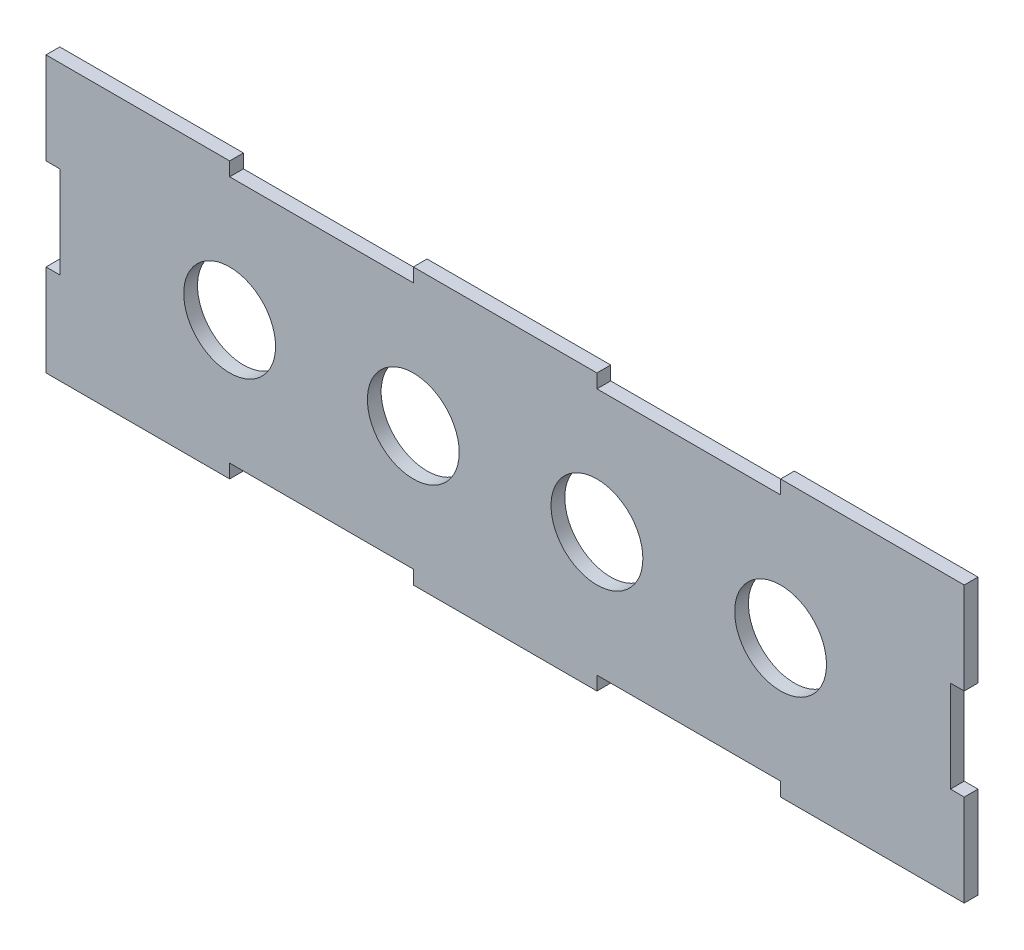
ISO-10303-21;
HEADER;
FILE_DESCRIPTION(('STEP AP214'),'2;1');
FILE_NAME('part.step','',(''),(''),'','','');
FILE_SCHEMA(('AUTOMOTIVE_DESIGN { 1 0 10303 214 1 1 1 1 }'));
ENDSEC;
DATA;
#1=APPLICATION_CONTEXT('core data for automotive mechanical design processes');
#2=APPLICATION_PROTOCOL_DEFINITION('international standard','automotive_design',2000,#1);
#3=PRODUCT_CONTEXT('',#1,'mechanical');
#4=PRODUCT('Part','Part','',(#3));
#5=PRODUCT_RELATED_PRODUCT_CATEGORY('part','',(#4));
#6=PRODUCT_DEFINITION_FORMATION('','',#4);
#7=PRODUCT_DEFINITION_CONTEXT('part definition',#1,'design');
#8=PRODUCT_DEFINITION('design','',#6,#7);
#9=PRODUCT_DEFINITION_SHAPE('','',#8);
#10=(LENGTH_UNIT() NAMED_UNIT(*) SI_UNIT(.MILLI.,.METRE.));
#11=(NAMED_UNIT(*) PLANE_ANGLE_UNIT() SI_UNIT($,.RADIAN.));
#12=(NAMED_UNIT(*) SI_UNIT($,.STERADIAN.) SOLID_ANGLE_UNIT());
#13=UNCERTAINTY_MEASURE_WITH_UNIT(LENGTH_MEASURE(1.E-05),#10,'distance_accuracy_value','');
#14=(GEOMETRIC_REPRESENTATION_CONTEXT(3) GLOBAL_UNCERTAINTY_ASSIGNED_CONTEXT((#13)) GLOBAL_UNIT_ASSIGNED_CONTEXT((#10,
#11,#12)) REPRESENTATION_CONTEXT('',''));
#15=CARTESIAN_POINT('',(0.,0.,0.));
#16=DIRECTION('',(0.,0.,1.));
#17=DIRECTION('',(1.,0.,0.));
#18=AXIS2_PLACEMENT_3D('',#15,#16,#17);
#19=CARTESIAN_POINT('',(-90.0000000000001,0.,3.));
#20=DIRECTION('',(1.,0.,0.));
#21=DIRECTION('',(0.,1.,0.));
#22=AXIS2_PLACEMENT_3D('',#19,#20,#21);
#23=PLANE('',#22);
#24=DIRECTION('',(0.,-1.,0.));
#25=VECTOR('',#24,1.);
#26=CARTESIAN_POINT('',(-90.0000000000001,0.,0.));
#27=LINE('',#26,#25);
#28=CARTESIAN_POINT('',(-90.0000000000001,30.,0.));
#29=VERTEX_POINT('',#28);
#30=CARTESIAN_POINT('',(-90.0000000000001,10.,0.));
#31=VERTEX_POINT('',#30);
#32=EDGE_CURVE('E255',#29,#31,#27,.T.);
#33=ORIENTED_EDGE('',*,*,#32,.T.);
#34=DIRECTION('',(0.,0.,-1.));
#35=VECTOR('',#34,1.);
#36=CARTESIAN_POINT('',(-90.0000000000001,10.,3.));
#37=LINE('',#36,#35);
#38=CARTESIAN_POINT('',(-90.0000000000001,10.,3.));
#39=VERTEX_POINT('',#38);
#40=EDGE_CURVE('E11',#39,#31,#37,.T.);
#41=ORIENTED_EDGE('',*,*,#40,.F.);
#42=DIRECTION('',(0.,-1.,0.));
#43=VECTOR('',#42,1.);
#44=CARTESIAN_POINT('',(-90.0000000000001,0.,3.));
#45=LINE('',#44,#43);
#46=CARTESIAN_POINT('',(-90.0000000000001,30.,3.));
#47=VERTEX_POINT('',#46);
#48=EDGE_CURVE('E324',#47,#39,#45,.T.);
#49=ORIENTED_EDGE('',*,*,#48,.F.);
#50=DIRECTION('',(0.,0.,-1.));
#51=VECTOR('',#50,1.);
#52=CARTESIAN_POINT('',(-90.0000000000001,30.,3.));
#53=LINE('',#52,#51);
#54=EDGE_CURVE('E54',#47,#29,#53,.T.);
#55=ORIENTED_EDGE('',*,*,#54,.T.);
#56=EDGE_LOOP('',(#33,#41,#49,#55));
#57=FACE_BOUND('',#56,.T.);
#58=ADVANCED_FACE('F38',(#57),#23,.F.);
#59=CARTESIAN_POINT('',(0.,10.,3.));
#60=DIRECTION('',(0.,1.,0.));
#61=DIRECTION('',(0.,0.,1.));
#62=AXIS2_PLACEMENT_3D('',#59,#60,#61);
#63=PLANE('',#62);
#64=DIRECTION('',(1.,0.,0.));
#65=VECTOR('',#64,1.);
#66=CARTESIAN_POINT('',(0.,10.,0.));
#67=LINE('',#66,#65);
#68=CARTESIAN_POINT('',(-87.0000000000001,10.,0.));
#69=VERTEX_POINT('',#68);
#70=EDGE_CURVE('E257',#31,#69,#67,.T.);
#71=ORIENTED_EDGE('',*,*,#70,.T.);
#72=DIRECTION('',(0.,0.,-1.));
#73=VECTOR('',#72,1.);
#74=CARTESIAN_POINT('',(-87.0000000000001,10.,3.));
#75=LINE('',#74,#73);
#76=CARTESIAN_POINT('',(-87.0000000000001,10.,3.));
#77=VERTEX_POINT('',#76);
#78=EDGE_CURVE('E46',#77,#69,#75,.T.);
#79=ORIENTED_EDGE('',*,*,#78,.F.);
#80=DIRECTION('',(1.,0.,0.));
#81=VECTOR('',#80,1.);
#82=CARTESIAN_POINT('',(0.,10.,3.));
#83=LINE('',#82,#81);
#84=EDGE_CURVE('E152',#39,#77,#83,.T.);
#85=ORIENTED_EDGE('',*,*,#84,.F.);
#86=ORIENTED_EDGE('',*,*,#40,.T.);
#87=EDGE_LOOP('',(#71,#79,#85,#86));
#88=FACE_BOUND('',#87,.T.);
#89=ADVANCED_FACE('F472',(#88),#63,.F.);
#90=CARTESIAN_POINT('',(-87.0000000000001,1.81105130891979E-13,3.));
#91=DIRECTION('',(1.,0.,0.));
#92=DIRECTION('',(0.,1.,0.));
#93=AXIS2_PLACEMENT_3D('',#90,#91,#92);
#94=PLANE('',#93);
#95=DIRECTION('',(0.,-1.,0.));
#96=VECTOR('',#95,1.);
#97=CARTESIAN_POINT('',(-87.0000000000001,1.81105130891979E-13,0.));
#98=LINE('',#97,#96);
#99=CARTESIAN_POINT('',(-87.0000000000001,-9.99999999999999,0.));
#100=VERTEX_POINT('',#99);
#101=EDGE_CURVE('E260',#69,#100,#98,.T.);
#102=ORIENTED_EDGE('',*,*,#101,.T.);
#103=DIRECTION('',(0.,0.,-1.));
#104=VECTOR('',#103,1.);
#105=CARTESIAN_POINT('',(-87.0000000000001,-9.99999999999999,3.));
#106=LINE('',#105,#104);
#107=CARTESIAN_POINT('',(-87.0000000000001,-9.99999999999999,3.));
#108=VERTEX_POINT('',#107);
#109=EDGE_CURVE('E380',#108,#100,#106,.T.);
#110=ORIENTED_EDGE('',*,*,#109,.F.);
#111=DIRECTION('',(0.,-1.,0.));
#112=VECTOR('',#111,1.);
#113=CARTESIAN_POINT('',(-87.0000000000001,1.81105130891979E-13,3.));
#114=LINE('',#113,#112);
#115=EDGE_CURVE('E388',#77,#108,#114,.T.);
#116=ORIENTED_EDGE('',*,*,#115,.F.);
#117=ORIENTED_EDGE('',*,*,#78,.T.);
#118=EDGE_LOOP('',(#102,#110,#116,#117));
#119=FACE_BOUND('',#118,.T.);
#120=ADVANCED_FACE('F386',(#119),#94,.F.);
#121=CARTESIAN_POINT('',(0.,-9.99999999999999,3.));
#122=DIRECTION('',(0.,-1.,0.));
#123=DIRECTION('',(0.,0.,-1.));
#124=AXIS2_PLACEMENT_3D('',#121,#122,#123);
#125=PLANE('',#124);
#126=DIRECTION('',(-1.,0.,0.));
#127=VECTOR('',#126,1.);
#128=CARTESIAN_POINT('',(0.,-9.99999999999999,0.));
#129=LINE('',#128,#127);
#130=CARTESIAN_POINT('',(-90.0000000000001,-9.99999999999999,0.));
#131=VERTEX_POINT('',#130);
#132=EDGE_CURVE('E262',#100,#131,#129,.T.);
#133=ORIENTED_EDGE('',*,*,#132,.T.);
#134=DIRECTION('',(0.,0.,-1.));
#135=VECTOR('',#134,1.);
#136=CARTESIAN_POINT('',(-90.0000000000001,-9.99999999999999,3.));
#137=LINE('',#136,#135);
#138=CARTESIAN_POINT('',(-90.0000000000001,-9.99999999999999,3.));
#139=VERTEX_POINT('',#138);
#140=EDGE_CURVE('E377',#139,#131,#137,.T.);
#141=ORIENTED_EDGE('',*,*,#140,.F.);
#142=DIRECTION('',(-1.,0.,0.));
#143=VECTOR('',#142,1.);
#144=CARTESIAN_POINT('',(0.,-9.99999999999999,3.));
#145=LINE('',#144,#143);
#146=EDGE_CURVE('E405',#108,#139,#145,.T.);
#147=ORIENTED_EDGE('',*,*,#146,.F.);
#148=ORIENTED_EDGE('',*,*,#109,.T.);
#149=EDGE_LOOP('',(#133,#141,#147,#148));
#150=FACE_BOUND('',#149,.T.);
#151=ADVANCED_FACE('F396',(#150),#125,.F.);
#152=CARTESIAN_POINT('',(-90.0000000000001,0.,3.));
#153=DIRECTION('',(1.,0.,0.));
#154=DIRECTION('',(0.,0.,-1.));
#155=AXIS2_PLACEMENT_3D('',#152,#153,#154);
#156=PLANE('',#155);
#157=DIRECTION('',(0.,-1.,0.));
#158=VECTOR('',#157,1.);
#159=CARTESIAN_POINT('',(-90.0000000000001,0.,0.));
#160=LINE('',#159,#158);
#161=CARTESIAN_POINT('',(-90.0000000000001,-30.,0.));
#162=VERTEX_POINT('',#161);
#163=EDGE_CURVE('E264',#131,#162,#160,.T.);
#164=ORIENTED_EDGE('',*,*,#163,.T.);
#165=DIRECTION('',(0.,0.,-1.));
#166=VECTOR('',#165,1.);
#167=CARTESIAN_POINT('',(-90.0000000000001,-30.,3.));
#168=LINE('',#167,#166);
#169=CARTESIAN_POINT('',(-90.0000000000001,-30.,3.));
#170=VERTEX_POINT('',#169);
#171=EDGE_CURVE('E374',#170,#162,#168,.T.);
#172=ORIENTED_EDGE('',*,*,#171,.F.);
#173=DIRECTION('',(0.,-1.,0.));
#174=VECTOR('',#173,1.);
#175=CARTESIAN_POINT('',(-90.0000000000001,0.,3.));
#176=LINE('',#175,#174);
#177=EDGE_CURVE('E402',#139,#170,#176,.T.);
#178=ORIENTED_EDGE('',*,*,#177,.F.);
#179=ORIENTED_EDGE('',*,*,#140,.T.);
#180=EDGE_LOOP('',(#164,#172,#178,#179));
#181=FACE_BOUND('',#180,.T.);
#182=ADVANCED_FACE('F400',(#181),#156,.F.);
#183=CARTESIAN_POINT('',(0.,-30.,3.));
#184=DIRECTION('',(0.,1.,0.));
#185=DIRECTION('',(0.,0.,1.));
#186=AXIS2_PLACEMENT_3D('',#183,#184,#185);
#187=PLANE('',#186);
#188=DIRECTION('',(1.,0.,0.));
#189=VECTOR('',#188,1.);
#190=CARTESIAN_POINT('',(0.,-30.,0.));
#191=LINE('',#190,#189);
#192=CARTESIAN_POINT('',(-50.0000000000001,-30.,0.));
#193=VERTEX_POINT('',#192);
#194=EDGE_CURVE('E266',#162,#193,#191,.T.);
#195=ORIENTED_EDGE('',*,*,#194,.T.);
#196=DIRECTION('',(0.,0.,-1.));
#197=VECTOR('',#196,1.);
#198=CARTESIAN_POINT('',(-50.0000000000001,-30.,3.));
#199=LINE('',#198,#197);
#200=CARTESIAN_POINT('',(-50.0000000000001,-30.,3.));
#201=VERTEX_POINT('',#200);
#202=EDGE_CURVE('E371',#201,#193,#199,.T.);
#203=ORIENTED_EDGE('',*,*,#202,.F.);
#204=DIRECTION('',(1.,0.,0.));
#205=VECTOR('',#204,1.);
#206=CARTESIAN_POINT('',(0.,-30.,3.));
#207=LINE('',#206,#205);
#208=EDGE_CURVE('E404',#170,#201,#207,.T.);
#209=ORIENTED_EDGE('',*,*,#208,.F.);
#210=ORIENTED_EDGE('',*,*,#171,.T.);
#211=EDGE_LOOP('',(#195,#203,#209,#210));
#212=FACE_BOUND('',#211,.T.);
#213=ADVANCED_FACE('F780',(#212),#187,.F.);
#214=CARTESIAN_POINT('',(-50.0000000000001,0.,3.));
#215=DIRECTION('',(-1.,0.,0.));
#216=DIRECTION('',(0.,0.,1.));
#217=AXIS2_PLACEMENT_3D('',#214,#215,#216);
#218=PLANE('',#217);
#219=DIRECTION('',(0.,1.,0.));
#220=VECTOR('',#219,1.);
#221=CARTESIAN_POINT('',(-50.0000000000001,0.,0.));
#222=LINE('',#221,#220);
#223=CARTESIAN_POINT('',(-50.0000000000001,-27.,0.));
#224=VERTEX_POINT('',#223);
#225=EDGE_CURVE('E268',#193,#224,#222,.T.);
#226=ORIENTED_EDGE('',*,*,#225,.T.);
#227=DIRECTION('',(0.,0.,-1.));
#228=VECTOR('',#227,1.);
#229=CARTESIAN_POINT('',(-50.0000000000001,-27.,3.));
#230=LINE('',#229,#228);
#231=CARTESIAN_POINT('',(-50.0000000000001,-27.,3.));
#232=VERTEX_POINT('',#231);
#233=EDGE_CURVE('E368',#232,#224,#230,.T.);
#234=ORIENTED_EDGE('',*,*,#233,.F.);
#235=DIRECTION('',(0.,1.,0.));
#236=VECTOR('',#235,1.);
#237=CARTESIAN_POINT('',(-50.0000000000001,0.,3.));
#238=LINE('',#237,#236);
#239=EDGE_CURVE('E407',#201,#232,#238,.T.);
#240=ORIENTED_EDGE('',*,*,#239,.F.);
#241=ORIENTED_EDGE('',*,*,#202,.T.);
#242=EDGE_LOOP('',(#226,#234,#240,#241));
#243=FACE_BOUND('',#242,.T.);
#244=ADVANCED_FACE('F770',(#243),#218,.F.);
#245=CARTESIAN_POINT('',(0.,-27.,3.));
#246=DIRECTION('',(0.,1.,0.));
#247=DIRECTION('',(0.,0.,1.));
#248=AXIS2_PLACEMENT_3D('',#245,#246,#247);
#249=PLANE('',#248);
#250=DIRECTION('',(1.,0.,0.));
#251=VECTOR('',#250,1.);
#252=CARTESIAN_POINT('',(0.,-27.,0.));
#253=LINE('',#252,#251);
#254=CARTESIAN_POINT('',(-10.0000000000001,-27.,0.));
#255=VERTEX_POINT('',#254);
#256=EDGE_CURVE('E270',#224,#255,#253,.T.);
#257=ORIENTED_EDGE('',*,*,#256,.T.);
#258=DIRECTION('',(0.,0.,-1.));
#259=VECTOR('',#258,1.);
#260=CARTESIAN_POINT('',(-10.0000000000001,-27.,3.));
#261=LINE('',#260,#259);
#262=CARTESIAN_POINT('',(-10.0000000000001,-27.,3.));
#263=VERTEX_POINT('',#262);
#264=EDGE_CURVE('E365',#263,#255,#261,.T.);
#265=ORIENTED_EDGE('',*,*,#264,.F.);
#266=DIRECTION('',(1.,0.,0.));
#267=VECTOR('',#266,1.);
#268=CARTESIAN_POINT('',(0.,-27.,3.));
#269=LINE('',#268,#267);
#270=EDGE_CURVE('E413',#232,#263,#269,.T.);
#271=ORIENTED_EDGE('',*,*,#270,.F.);
#272=ORIENTED_EDGE('',*,*,#233,.T.);
#273=EDGE_LOOP('',(#257,#265,#271,#272));
#274=FACE_BOUND('',#273,.T.);
#275=ADVANCED_FACE('F759',(#274),#249,.F.);
#276=CARTESIAN_POINT('',(-10.0000000000001,0.,3.));
#277=DIRECTION('',(1.,0.,0.));
#278=DIRECTION('',(0.,0.,-1.));
#279=AXIS2_PLACEMENT_3D('',#276,#277,#278);
#280=PLANE('',#279);
#281=DIRECTION('',(0.,-1.,0.));
#282=VECTOR('',#281,1.);
#283=CARTESIAN_POINT('',(-10.0000000000001,0.,0.));
#284=LINE('',#283,#282);
#285=CARTESIAN_POINT('',(-10.0000000000001,-30.,0.));
#286=VERTEX_POINT('',#285);
#287=EDGE_CURVE('E272',#255,#286,#284,.T.);
#288=ORIENTED_EDGE('',*,*,#287,.T.);
#289=DIRECTION('',(0.,0.,-1.));
#290=VECTOR('',#289,1.);
#291=CARTESIAN_POINT('',(-10.0000000000001,-30.,3.));
#292=LINE('',#291,#290);
#293=CARTESIAN_POINT('',(-10.0000000000001,-30.,3.));
#294=VERTEX_POINT('',#293);
#295=EDGE_CURVE('E362',#294,#286,#292,.T.);
#296=ORIENTED_EDGE('',*,*,#295,.F.);
#297=DIRECTION('',(0.,-1.,0.));
#298=VECTOR('',#297,1.);
#299=CARTESIAN_POINT('',(-10.0000000000001,0.,3.));
#300=LINE('',#299,#298);
#301=EDGE_CURVE('E415',#263,#294,#300,.T.);
#302=ORIENTED_EDGE('',*,*,#301,.F.);
#303=ORIENTED_EDGE('',*,*,#264,.T.);
#304=EDGE_LOOP('',(#288,#296,#302,#303));
#305=FACE_BOUND('',#304,.T.);
#306=ADVANCED_FACE('F748',(#305),#280,.F.);
#307=CARTESIAN_POINT('',(0.,-30.,3.));
#308=DIRECTION('',(0.,1.,0.));
#309=DIRECTION('',(0.,0.,1.));
#310=AXIS2_PLACEMENT_3D('',#307,#308,#309);
#311=PLANE('',#310);
#312=DIRECTION('',(1.,0.,0.));
#313=VECTOR('',#312,1.);
#314=CARTESIAN_POINT('',(0.,-30.,0.));
#315=LINE('',#314,#313);
#316=CARTESIAN_POINT('',(29.9999999999999,-30.,0.));
#317=VERTEX_POINT('',#316);
#318=EDGE_CURVE('E274',#286,#317,#315,.T.);
#319=ORIENTED_EDGE('',*,*,#318,.T.);
#320=DIRECTION('',(0.,0.,-1.));
#321=VECTOR('',#320,1.);
#322=CARTESIAN_POINT('',(29.9999999999999,-30.,3.));
#323=LINE('',#322,#321);
#324=CARTESIAN_POINT('',(29.9999999999999,-30.,3.));
#325=VERTEX_POINT('',#324);
#326=EDGE_CURVE('E359',#325,#317,#323,.T.);
#327=ORIENTED_EDGE('',*,*,#326,.F.);
#328=DIRECTION('',(1.,0.,0.));
#329=VECTOR('',#328,1.);
#330=CARTESIAN_POINT('',(0.,-30.,3.));
#331=LINE('',#330,#329);
#332=EDGE_CURVE('E417',#294,#325,#331,.T.);
#333=ORIENTED_EDGE('',*,*,#332,.F.);
#334=ORIENTED_EDGE('',*,*,#295,.T.);
#335=EDGE_LOOP('',(#319,#327,#333,#334));
#336=FACE_BOUND('',#335,.T.);
#337=ADVANCED_FACE('F738',(#336),#311,.F.);
#338=CARTESIAN_POINT('',(29.9999999999999,0.,3.));
#339=DIRECTION('',(-1.,0.,0.));
#340=DIRECTION('',(0.,0.,1.));
#341=AXIS2_PLACEMENT_3D('',#338,#339,#340);
#342=PLANE('',#341);
#343=DIRECTION('',(0.,1.,0.));
#344=VECTOR('',#343,1.);
#345=CARTESIAN_POINT('',(29.9999999999999,0.,0.));
#346=LINE('',#345,#344);
#347=CARTESIAN_POINT('',(29.9999999999999,-27.,0.));
#348=VERTEX_POINT('',#347);
#349=EDGE_CURVE('E276',#317,#348,#346,.T.);
#350=ORIENTED_EDGE('',*,*,#349,.T.);
#351=DIRECTION('',(0.,0.,-1.));
#352=VECTOR('',#351,1.);
#353=CARTESIAN_POINT('',(29.9999999999999,-27.,3.));
#354=LINE('',#353,#352);
#355=CARTESIAN_POINT('',(29.9999999999999,-27.,3.));
#356=VERTEX_POINT('',#355);
#357=EDGE_CURVE('E356',#356,#348,#354,.T.);
#358=ORIENTED_EDGE('',*,*,#357,.F.);
#359=DIRECTION('',(0.,1.,0.));
#360=VECTOR('',#359,1.);
#361=CARTESIAN_POINT('',(29.9999999999999,0.,3.));
#362=LINE('',#361,#360);
#363=EDGE_CURVE('E419',#325,#356,#362,.T.);
#364=ORIENTED_EDGE('',*,*,#363,.F.);
#365=ORIENTED_EDGE('',*,*,#326,.T.);
#366=EDGE_LOOP('',(#350,#358,#364,#365));
#367=FACE_BOUND('',#366,.T.);
#368=ADVANCED_FACE('F728',(#367),#342,.F.);
#369=CARTESIAN_POINT('',(0.,-27.,3.));
#370=DIRECTION('',(0.,1.,0.));
#371=DIRECTION('',(-1.,0.,0.));
#372=AXIS2_PLACEMENT_3D('',#369,#370,#371);
#373=PLANE('',#372);
#374=DIRECTION('',(1.,0.,0.));
#375=VECTOR('',#374,1.);
#376=CARTESIAN_POINT('',(0.,-27.,0.));
#377=LINE('',#376,#375);
#378=CARTESIAN_POINT('',(69.9999999999999,-27.,0.));
#379=VERTEX_POINT('',#378);
#380=EDGE_CURVE('E278',#348,#379,#377,.T.);
#381=ORIENTED_EDGE('',*,*,#380,.T.);
#382=DIRECTION('',(0.,0.,-1.));
#383=VECTOR('',#382,1.);
#384=CARTESIAN_POINT('',(69.9999999999999,-27.,3.));
#385=LINE('',#384,#383);
#386=CARTESIAN_POINT('',(69.9999999999999,-27.,3.));
#387=VERTEX_POINT('',#386);
#388=EDGE_CURVE('E353',#387,#379,#385,.T.);
#389=ORIENTED_EDGE('',*,*,#388,.F.);
#390=DIRECTION('',(1.,0.,0.));
#391=VECTOR('',#390,1.);
#392=CARTESIAN_POINT('',(0.,-27.,3.));
#393=LINE('',#392,#391);
#394=EDGE_CURVE('E421',#356,#387,#393,.T.);
#395=ORIENTED_EDGE('',*,*,#394,.F.);
#396=ORIENTED_EDGE('',*,*,#357,.T.);
#397=EDGE_LOOP('',(#381,#389,#395,#396));
#398=FACE_BOUND('',#397,.T.);
#399=ADVANCED_FACE('F717',(#398),#373,.F.);
#400=CARTESIAN_POINT('',(69.9999999999999,0.,3.));
#401=DIRECTION('',(1.,0.,0.));
#402=DIRECTION('',(0.,0.,-1.));
#403=AXIS2_PLACEMENT_3D('',#400,#401,#402);
#404=PLANE('',#403);
#405=DIRECTION('',(0.,-1.,0.));
#406=VECTOR('',#405,1.);
#407=CARTESIAN_POINT('',(69.9999999999999,0.,0.));
#408=LINE('',#407,#406);
#409=CARTESIAN_POINT('',(69.9999999999999,-30.,0.));
#410=VERTEX_POINT('',#409);
#411=EDGE_CURVE('E280',#379,#410,#408,.T.);
#412=ORIENTED_EDGE('',*,*,#411,.T.);
#413=DIRECTION('',(0.,0.,-1.));
#414=VECTOR('',#413,1.);
#415=CARTESIAN_POINT('',(69.9999999999999,-30.,3.));
#416=LINE('',#415,#414);
#417=CARTESIAN_POINT('',(69.9999999999999,-30.,3.));
#418=VERTEX_POINT('',#417);
#419=EDGE_CURVE('E350',#418,#410,#416,.T.);
#420=ORIENTED_EDGE('',*,*,#419,.F.);
#421=DIRECTION('',(0.,-1.,0.));
#422=VECTOR('',#421,1.);
#423=CARTESIAN_POINT('',(69.9999999999999,0.,3.));
#424=LINE('',#423,#422);
#425=EDGE_CURVE('E423',#387,#418,#424,.T.);
#426=ORIENTED_EDGE('',*,*,#425,.F.);
#427=ORIENTED_EDGE('',*,*,#388,.T.);
#428=EDGE_LOOP('',(#412,#420,#426,#427));
#429=FACE_BOUND('',#428,.T.);
#430=ADVANCED_FACE('F706',(#429),#404,.F.);
#431=CARTESIAN_POINT('',(0.,-30.,3.));
#432=DIRECTION('',(0.,1.,0.));
#433=DIRECTION('',(0.,0.,1.));
#434=AXIS2_PLACEMENT_3D('',#431,#432,#433);
#435=PLANE('',#434);
#436=DIRECTION('',(1.,0.,0.));
#437=VECTOR('',#436,1.);
#438=CARTESIAN_POINT('',(0.,-30.,0.));
#439=LINE('',#438,#437);
#440=CARTESIAN_POINT('',(110.,-30.,0.));
#441=VERTEX_POINT('',#440);
#442=EDGE_CURVE('E282',#410,#441,#439,.T.);
#443=ORIENTED_EDGE('',*,*,#442,.T.);
#444=DIRECTION('',(0.,0.,-1.));
#445=VECTOR('',#444,1.);
#446=CARTESIAN_POINT('',(110.,-30.,3.));
#447=LINE('',#446,#445);
#448=CARTESIAN_POINT('',(110.,-30.,3.));
#449=VERTEX_POINT('',#448);
#450=EDGE_CURVE('E348',#449,#441,#447,.T.);
#451=ORIENTED_EDGE('',*,*,#450,.F.);
#452=DIRECTION('',(1.,0.,0.));
#453=VECTOR('',#452,1.);
#454=CARTESIAN_POINT('',(0.,-30.,3.));
#455=LINE('',#454,#453);
#456=EDGE_CURVE('E425',#418,#449,#455,.T.);
#457=ORIENTED_EDGE('',*,*,#456,.F.);
#458=ORIENTED_EDGE('',*,*,#419,.T.);
#459=EDGE_LOOP('',(#443,#451,#457,#458));
#460=FACE_BOUND('',#459,.T.);
#461=ADVANCED_FACE('F696',(#460),#435,.F.);
#462=CARTESIAN_POINT('',(110.,0.,3.));
#463=DIRECTION('',(1.,0.,0.));
#464=DIRECTION('',(0.,1.,0.));
#465=AXIS2_PLACEMENT_3D('',#462,#463,#464);
#466=PLANE('',#465);
#467=DIRECTION('',(0.,-1.,0.));
#468=VECTOR('',#467,1.);
#469=CARTESIAN_POINT('',(110.,0.,0.));
#470=LINE('',#469,#468);
#471=CARTESIAN_POINT('',(110.,-9.99999999999999,0.));
#472=VERTEX_POINT('',#471);
#473=EDGE_CURVE('E285',#472,#441,#470,.T.);
#474=ORIENTED_EDGE('',*,*,#473,.F.);
#475=DIRECTION('',(0.,0.,-1.));
#476=VECTOR('',#475,1.);
#477=CARTESIAN_POINT('',(110.,-9.99999999999999,3.));
#478=LINE('',#477,#476);
#479=CARTESIAN_POINT('',(110.,-9.99999999999999,3.));
#480=VERTEX_POINT('',#479);
#481=EDGE_CURVE('E346',#480,#472,#478,.T.);
#482=ORIENTED_EDGE('',*,*,#481,.F.);
#483=DIRECTION('',(0.,-1.,0.));
#484=VECTOR('',#483,1.);
#485=CARTESIAN_POINT('',(110.,0.,3.));
#486=LINE('',#485,#484);
#487=EDGE_CURVE('E427',#480,#449,#486,.T.);
#488=ORIENTED_EDGE('',*,*,#487,.T.);
#489=ORIENTED_EDGE('',*,*,#450,.T.);
#490=EDGE_LOOP('',(#474,#482,#488,#489));
#491=FACE_BOUND('',#490,.T.);
#492=ADVANCED_FACE('F686',(#491),#466,.T.);
#493=CARTESIAN_POINT('',(0.,-9.99999999999999,3.));
#494=DIRECTION('',(0.,1.,0.));
#495=DIRECTION('',(0.,0.,1.));
#496=AXIS2_PLACEMENT_3D('',#493,#494,#495);
#497=PLANE('',#496);
#498=DIRECTION('',(1.,0.,0.));
#499=VECTOR('',#498,1.);
#500=CARTESIAN_POINT('',(0.,-9.99999999999999,0.));
#501=LINE('',#500,#499);
#502=CARTESIAN_POINT('',(107.,-9.99999999999999,0.));
#503=VERTEX_POINT('',#502);
#504=EDGE_CURVE('E288',#503,#472,#501,.T.);
#505=ORIENTED_EDGE('',*,*,#504,.F.);
#506=DIRECTION('',(0.,0.,-1.));
#507=VECTOR('',#506,1.);
#508=CARTESIAN_POINT('',(107.,-9.99999999999999,3.));
#509=LINE('',#508,#507);
#510=CARTESIAN_POINT('',(107.,-9.99999999999999,3.));
#511=VERTEX_POINT('',#510);
#512=EDGE_CURVE('E344',#511,#503,#509,.T.);
#513=ORIENTED_EDGE('',*,*,#512,.F.);
#514=DIRECTION('',(1.,0.,0.));
#515=VECTOR('',#514,1.);
#516=CARTESIAN_POINT('',(0.,-9.99999999999999,3.));
#517=LINE('',#516,#515);
#518=EDGE_CURVE('E430',#511,#480,#517,.T.);
#519=ORIENTED_EDGE('',*,*,#518,.T.);
#520=ORIENTED_EDGE('',*,*,#481,.T.);
#521=EDGE_LOOP('',(#505,#513,#519,#520));
#522=FACE_BOUND('',#521,.T.);
#523=ADVANCED_FACE('F676',(#522),#497,.T.);
#524=CARTESIAN_POINT('',(107.,0.,3.));
#525=DIRECTION('',(1.,0.,0.));
#526=DIRECTION('',(0.,1.,0.));
#527=AXIS2_PLACEMENT_3D('',#524,#525,#526);
#528=PLANE('',#527);
#529=DIRECTION('',(0.,-1.,0.));
#530=VECTOR('',#529,1.);
#531=CARTESIAN_POINT('',(107.,0.,0.));
#532=LINE('',#531,#530);
#533=CARTESIAN_POINT('',(107.,10.,0.));
#534=VERTEX_POINT('',#533);
#535=EDGE_CURVE('E291',#534,#503,#532,.T.);
#536=ORIENTED_EDGE('',*,*,#535,.F.);
#537=DIRECTION('',(0.,0.,-1.));
#538=VECTOR('',#537,1.);
#539=CARTESIAN_POINT('',(107.,10.,3.));
#540=LINE('',#539,#538);
#541=CARTESIAN_POINT('',(107.,10.,3.));
#542=VERTEX_POINT('',#541);
#543=EDGE_CURVE('E342',#542,#534,#540,.T.);
#544=ORIENTED_EDGE('',*,*,#543,.F.);
#545=DIRECTION('',(0.,-1.,0.));
#546=VECTOR('',#545,1.);
#547=CARTESIAN_POINT('',(107.,0.,3.));
#548=LINE('',#547,#546);
#549=EDGE_CURVE('E433',#542,#511,#548,.T.);
#550=ORIENTED_EDGE('',*,*,#549,.T.);
#551=ORIENTED_EDGE('',*,*,#512,.T.);
#552=EDGE_LOOP('',(#536,#544,#550,#551));
#553=FACE_BOUND('',#552,.T.);
#554=ADVANCED_FACE('F666',(#553),#528,.T.);
#555=CARTESIAN_POINT('',(0.,10.,3.));
#556=DIRECTION('',(0.,-1.,0.));
#557=DIRECTION('',(0.,0.,-1.));
#558=AXIS2_PLACEMENT_3D('',#555,#556,#557);
#559=PLANE('',#558);
#560=DIRECTION('',(-1.,0.,0.));
#561=VECTOR('',#560,1.);
#562=CARTESIAN_POINT('',(0.,10.,0.));
#563=LINE('',#562,#561);
#564=CARTESIAN_POINT('',(110.,10.,0.));
#565=VERTEX_POINT('',#564);
#566=EDGE_CURVE('E294',#565,#534,#563,.T.);
#567=ORIENTED_EDGE('',*,*,#566,.F.);
#568=DIRECTION('',(0.,0.,-1.));
#569=VECTOR('',#568,1.);
#570=CARTESIAN_POINT('',(110.,10.,3.));
#571=LINE('',#570,#569);
#572=CARTESIAN_POINT('',(110.,10.,3.));
#573=VERTEX_POINT('',#572);
#574=EDGE_CURVE('E340',#573,#565,#571,.T.);
#575=ORIENTED_EDGE('',*,*,#574,.F.);
#576=DIRECTION('',(-1.,0.,0.));
#577=VECTOR('',#576,1.);
#578=CARTESIAN_POINT('',(0.,10.,3.));
#579=LINE('',#578,#577);
#580=EDGE_CURVE('E436',#573,#542,#579,.T.);
#581=ORIENTED_EDGE('',*,*,#580,.T.);
#582=ORIENTED_EDGE('',*,*,#543,.T.);
#583=EDGE_LOOP('',(#567,#575,#581,#582));
#584=FACE_BOUND('',#583,.T.);
#585=ADVANCED_FACE('F655',(#584),#559,.T.);
#586=CARTESIAN_POINT('',(110.,0.,3.));
#587=DIRECTION('',(1.,0.,0.));
#588=DIRECTION('',(0.,1.,0.));
#589=AXIS2_PLACEMENT_3D('',#586,#587,#588);
#590=PLANE('',#589);
#591=DIRECTION('',(0.,-1.,0.));
#592=VECTOR('',#591,1.);
#593=CARTESIAN_POINT('',(110.,0.,0.));
#594=LINE('',#593,#592);
#595=CARTESIAN_POINT('',(110.,30.,0.));
#596=VERTEX_POINT('',#595);
#597=EDGE_CURVE('E297',#596,#565,#594,.T.);
#598=ORIENTED_EDGE('',*,*,#597,.F.);
#599=DIRECTION('',(0.,0.,-1.));
#600=VECTOR('',#599,1.);
#601=CARTESIAN_POINT('',(110.,30.,3.));
#602=LINE('',#601,#600);
#603=CARTESIAN_POINT('',(110.,30.,3.));
#604=VERTEX_POINT('',#603);
#605=EDGE_CURVE('E338',#604,#596,#602,.T.);
#606=ORIENTED_EDGE('',*,*,#605,.F.);
#607=DIRECTION('',(0.,-1.,0.));
#608=VECTOR('',#607,1.);
#609=CARTESIAN_POINT('',(110.,0.,3.));
#610=LINE('',#609,#608);
#611=EDGE_CURVE('E439',#604,#573,#610,.T.);
#612=ORIENTED_EDGE('',*,*,#611,.T.);
#613=ORIENTED_EDGE('',*,*,#574,.T.);
#614=EDGE_LOOP('',(#598,#606,#612,#613));
#615=FACE_BOUND('',#614,.T.);
#616=ADVANCED_FACE('F644',(#615),#590,.T.);
#617=CARTESIAN_POINT('',(0.,30.,3.));
#618=DIRECTION('',(0.,1.,0.));
#619=DIRECTION('',(0.,0.,1.));
#620=AXIS2_PLACEMENT_3D('',#617,#618,#619);
#621=PLANE('',#620);
#622=DIRECTION('',(1.,0.,0.));
#623=VECTOR('',#622,1.);
#624=CARTESIAN_POINT('',(0.,30.,0.));
#625=LINE('',#624,#623);
#626=CARTESIAN_POINT('',(69.9999999999999,30.,0.));
#627=VERTEX_POINT('',#626);
#628=EDGE_CURVE('E300',#627,#596,#625,.T.);
#629=ORIENTED_EDGE('',*,*,#628,.F.);
#630=DIRECTION('',(0.,0.,-1.));
#631=VECTOR('',#630,1.);
#632=CARTESIAN_POINT('',(69.9999999999999,30.,3.));
#633=LINE('',#632,#631);
#634=CARTESIAN_POINT('',(69.9999999999999,30.,3.));
#635=VERTEX_POINT('',#634);
#636=EDGE_CURVE('E336',#635,#627,#633,.T.);
#637=ORIENTED_EDGE('',*,*,#636,.F.);
#638=DIRECTION('',(1.,0.,0.));
#639=VECTOR('',#638,1.);
#640=CARTESIAN_POINT('',(0.,30.,3.));
#641=LINE('',#640,#639);
#642=EDGE_CURVE('E442',#635,#604,#641,.T.);
#643=ORIENTED_EDGE('',*,*,#642,.T.);
#644=ORIENTED_EDGE('',*,*,#605,.T.);
#645=EDGE_LOOP('',(#629,#637,#643,#644));
#646=FACE_BOUND('',#645,.T.);
#647=ADVANCED_FACE('F634',(#646),#621,.T.);
#648=CARTESIAN_POINT('',(69.9999999999999,0.,3.));
#649=DIRECTION('',(-1.,0.,0.));
#650=DIRECTION('',(0.,0.,1.));
#651=AXIS2_PLACEMENT_3D('',#648,#649,#650);
#652=PLANE('',#651);
#653=DIRECTION('',(0.,1.,0.));
#654=VECTOR('',#653,1.);
#655=CARTESIAN_POINT('',(69.9999999999999,0.,0.));
#656=LINE('',#655,#654);
#657=CARTESIAN_POINT('',(69.9999999999999,27.,0.));
#658=VERTEX_POINT('',#657);
#659=EDGE_CURVE('E303',#658,#627,#656,.T.);
#660=ORIENTED_EDGE('',*,*,#659,.F.);
#661=DIRECTION('',(0.,0.,-1.));
#662=VECTOR('',#661,1.);
#663=CARTESIAN_POINT('',(69.9999999999999,27.,3.));
#664=LINE('',#663,#662);
#665=CARTESIAN_POINT('',(69.9999999999999,27.,3.));
#666=VERTEX_POINT('',#665);
#667=EDGE_CURVE('E334',#666,#658,#664,.T.);
#668=ORIENTED_EDGE('',*,*,#667,.F.);
#669=DIRECTION('',(0.,1.,0.));
#670=VECTOR('',#669,1.);
#671=CARTESIAN_POINT('',(69.9999999999999,0.,3.));
#672=LINE('',#671,#670);
#673=EDGE_CURVE('E445',#666,#635,#672,.T.);
#674=ORIENTED_EDGE('',*,*,#673,.T.);
#675=ORIENTED_EDGE('',*,*,#636,.T.);
#676=EDGE_LOOP('',(#660,#668,#674,#675));
#677=FACE_BOUND('',#676,.T.);
#678=ADVANCED_FACE('F624',(#677),#652,.T.);
#679=CARTESIAN_POINT('',(0.,27.,3.));
#680=DIRECTION('',(0.,1.,0.));
#681=DIRECTION('',(-1.,0.,0.));
#682=AXIS2_PLACEMENT_3D('',#679,#680,#681);
#683=PLANE('',#682);
#684=DIRECTION('',(1.,0.,0.));
#685=VECTOR('',#684,1.);
#686=CARTESIAN_POINT('',(0.,27.,0.));
#687=LINE('',#686,#685);
#688=CARTESIAN_POINT('',(29.9999999999999,27.,0.));
#689=VERTEX_POINT('',#688);
#690=EDGE_CURVE('E306',#689,#658,#687,.T.);
#691=ORIENTED_EDGE('',*,*,#690,.F.);
#692=DIRECTION('',(0.,0.,-1.));
#693=VECTOR('',#692,1.);
#694=CARTESIAN_POINT('',(29.9999999999999,27.,3.));
#695=LINE('',#694,#693);
#696=CARTESIAN_POINT('',(29.9999999999999,27.,3.));
#697=VERTEX_POINT('',#696);
#698=EDGE_CURVE('E332',#697,#689,#695,.T.);
#699=ORIENTED_EDGE('',*,*,#698,.F.);
#700=DIRECTION('',(1.,0.,0.));
#701=VECTOR('',#700,1.);
#702=CARTESIAN_POINT('',(0.,27.,3.));
#703=LINE('',#702,#701);
#704=EDGE_CURVE('E448',#697,#666,#703,.T.);
#705=ORIENTED_EDGE('',*,*,#704,.T.);
#706=ORIENTED_EDGE('',*,*,#667,.T.);
#707=EDGE_LOOP('',(#691,#699,#705,#706));
#708=FACE_BOUND('',#707,.T.);
#709=ADVANCED_FACE('F614',(#708),#683,.T.);
#710=CARTESIAN_POINT('',(29.9999999999999,0.,3.));
#711=DIRECTION('',(1.,0.,0.));
#712=DIRECTION('',(0.,1.,0.));
#713=AXIS2_PLACEMENT_3D('',#710,#711,#712);
#714=PLANE('',#713);
#715=DIRECTION('',(0.,-1.,0.));
#716=VECTOR('',#715,1.);
#717=CARTESIAN_POINT('',(29.9999999999999,0.,0.));
#718=LINE('',#717,#716);
#719=CARTESIAN_POINT('',(29.9999999999999,30.,0.));
#720=VERTEX_POINT('',#719);
#721=EDGE_CURVE('E309',#720,#689,#718,.T.);
#722=ORIENTED_EDGE('',*,*,#721,.F.);
#723=DIRECTION('',(0.,0.,-1.));
#724=VECTOR('',#723,1.);
#725=CARTESIAN_POINT('',(29.9999999999999,30.,3.));
#726=LINE('',#725,#724);
#727=CARTESIAN_POINT('',(29.9999999999999,30.,3.));
#728=VERTEX_POINT('',#727);
#729=EDGE_CURVE('E330',#728,#720,#726,.T.);
#730=ORIENTED_EDGE('',*,*,#729,.F.);
#731=DIRECTION('',(0.,-1.,0.));
#732=VECTOR('',#731,1.);
#733=CARTESIAN_POINT('',(29.9999999999999,0.,3.));
#734=LINE('',#733,#732);
#735=EDGE_CURVE('E451',#728,#697,#734,.T.);
#736=ORIENTED_EDGE('',*,*,#735,.T.);
#737=ORIENTED_EDGE('',*,*,#698,.T.);
#738=EDGE_LOOP('',(#722,#730,#736,#737));
#739=FACE_BOUND('',#738,.T.);
#740=ADVANCED_FACE('F602',(#739),#714,.T.);
#741=CARTESIAN_POINT('',(0.,30.,3.));
#742=DIRECTION('',(0.,1.,0.));
#743=DIRECTION('',(0.,0.,1.));
#744=AXIS2_PLACEMENT_3D('',#741,#742,#743);
#745=PLANE('',#744);
#746=DIRECTION('',(1.,0.,0.));
#747=VECTOR('',#746,1.);
#748=CARTESIAN_POINT('',(0.,30.,0.));
#749=LINE('',#748,#747);
#750=CARTESIAN_POINT('',(-10.0000000000001,30.,0.));
#751=VERTEX_POINT('',#750);
#752=EDGE_CURVE('E312',#751,#720,#749,.T.);
#753=ORIENTED_EDGE('',*,*,#752,.F.);
#754=DIRECTION('',(0.,0.,-1.));
#755=VECTOR('',#754,1.);
#756=CARTESIAN_POINT('',(-10.0000000000001,30.,3.));
#757=LINE('',#756,#755);
#758=CARTESIAN_POINT('',(-10.0000000000001,30.,3.));
#759=VERTEX_POINT('',#758);
#760=EDGE_CURVE('E328',#759,#751,#757,.T.);
#761=ORIENTED_EDGE('',*,*,#760,.F.);
#762=DIRECTION('',(1.,0.,0.));
#763=VECTOR('',#762,1.);
#764=CARTESIAN_POINT('',(0.,30.,3.));
#765=LINE('',#764,#763);
#766=EDGE_CURVE('E454',#759,#728,#765,.T.);
#767=ORIENTED_EDGE('',*,*,#766,.T.);
#768=ORIENTED_EDGE('',*,*,#729,.T.);
#769=EDGE_LOOP('',(#753,#761,#767,#768));
#770=FACE_BOUND('',#769,.T.);
#771=ADVANCED_FACE('F594',(#770),#745,.T.);
#772=CARTESIAN_POINT('',(-10.0000000000001,0.,3.));
#773=DIRECTION('',(-1.,0.,0.));
#774=DIRECTION('',(0.,0.,1.));
#775=AXIS2_PLACEMENT_3D('',#772,#773,#774);
#776=PLANE('',#775);
#777=DIRECTION('',(0.,1.,0.));
#778=VECTOR('',#777,1.);
#779=CARTESIAN_POINT('',(-10.0000000000001,0.,0.));
#780=LINE('',#779,#778);
#781=CARTESIAN_POINT('',(-10.0000000000001,27.,0.));
#782=VERTEX_POINT('',#781);
#783=EDGE_CURVE('E315',#782,#751,#780,.T.);
#784=ORIENTED_EDGE('',*,*,#783,.F.);
#785=DIRECTION('',(0.,0.,-1.));
#786=VECTOR('',#785,1.);
#787=CARTESIAN_POINT('',(-10.0000000000001,27.,3.));
#788=LINE('',#787,#786);
#789=CARTESIAN_POINT('',(-10.0000000000001,27.,3.));
#790=VERTEX_POINT('',#789);
#791=EDGE_CURVE('E237',#790,#782,#788,.T.);
#792=ORIENTED_EDGE('',*,*,#791,.F.);
#793=DIRECTION('',(0.,1.,0.));
#794=VECTOR('',#793,1.);
#795=CARTESIAN_POINT('',(-10.0000000000001,0.,3.));
#796=LINE('',#795,#794);
#797=EDGE_CURVE('E247',#790,#759,#796,.T.);
#798=ORIENTED_EDGE('',*,*,#797,.T.);
#799=ORIENTED_EDGE('',*,*,#760,.T.);
#800=EDGE_LOOP('',(#784,#792,#798,#799));
#801=FACE_BOUND('',#800,.T.);
#802=ADVANCED_FACE('F458',(#801),#776,.T.);
#803=CARTESIAN_POINT('',(0.,27.,3.));
#804=DIRECTION('',(0.,1.,0.));
#805=DIRECTION('',(0.,0.,1.));
#806=AXIS2_PLACEMENT_3D('',#803,#804,#805);
#807=PLANE('',#806);
#808=DIRECTION('',(1.,0.,0.));
#809=VECTOR('',#808,1.);
#810=CARTESIAN_POINT('',(0.,27.,0.));
#811=LINE('',#810,#809);
#812=CARTESIAN_POINT('',(-50.0000000000001,27.,0.));
#813=VERTEX_POINT('',#812);
#814=EDGE_CURVE('E233',#813,#782,#811,.T.);
#815=ORIENTED_EDGE('',*,*,#814,.F.);
#816=DIRECTION('',(0.,0.,-1.));
#817=VECTOR('',#816,1.);
#818=CARTESIAN_POINT('',(-50.0000000000001,27.,3.));
#819=LINE('',#818,#817);
#820=CARTESIAN_POINT('',(-50.0000000000001,27.,3.));
#821=VERTEX_POINT('',#820);
#822=EDGE_CURVE('E228',#821,#813,#819,.T.);
#823=ORIENTED_EDGE('',*,*,#822,.F.);
#824=DIRECTION('',(1.,0.,0.));
#825=VECTOR('',#824,1.);
#826=CARTESIAN_POINT('',(0.,27.,3.));
#827=LINE('',#826,#825);
#828=EDGE_CURVE('E231',#821,#790,#827,.T.);
#829=ORIENTED_EDGE('',*,*,#828,.T.);
#830=ORIENTED_EDGE('',*,*,#791,.T.);
#831=EDGE_LOOP('',(#815,#823,#829,#830));
#832=FACE_BOUND('',#831,.T.);
#833=ADVANCED_FACE('F230',(#832),#807,.T.);
#834=CARTESIAN_POINT('',(-50.0000000000001,0.,3.));
#835=DIRECTION('',(1.,0.,0.));
#836=DIRECTION('',(0.,0.,-1.));
#837=AXIS2_PLACEMENT_3D('',#834,#835,#836);
#838=PLANE('',#837);
#839=DIRECTION('',(0.,-1.,0.));
#840=VECTOR('',#839,1.);
#841=CARTESIAN_POINT('',(-50.0000000000001,0.,0.));
#842=LINE('',#841,#840);
#843=CARTESIAN_POINT('',(-50.0000000000001,30.,0.));
#844=VERTEX_POINT('',#843);
#845=EDGE_CURVE('E319',#844,#813,#842,.T.);
#846=ORIENTED_EDGE('',*,*,#845,.F.);
#847=DIRECTION('',(0.,0.,-1.));
#848=VECTOR('',#847,1.);
#849=CARTESIAN_POINT('',(-50.0000000000001,30.,3.));
#850=LINE('',#849,#848);
#851=CARTESIAN_POINT('',(-50.0000000000001,30.,3.));
#852=VERTEX_POINT('',#851);
#853=EDGE_CURVE('E140',#852,#844,#850,.T.);
#854=ORIENTED_EDGE('',*,*,#853,.F.);
#855=DIRECTION('',(0.,-1.,0.));
#856=VECTOR('',#855,1.);
#857=CARTESIAN_POINT('',(-50.0000000000001,0.,3.));
#858=LINE('',#857,#856);
#859=EDGE_CURVE('E244',#852,#821,#858,.T.);
#860=ORIENTED_EDGE('',*,*,#859,.T.);
#861=ORIENTED_EDGE('',*,*,#822,.T.);
#862=EDGE_LOOP('',(#846,#854,#860,#861));
#863=FACE_BOUND('',#862,.T.);
#864=ADVANCED_FACE('F249',(#863),#838,.T.);
#865=CARTESIAN_POINT('',(0.,30.,3.));
#866=DIRECTION('',(0.,1.,0.));
#867=DIRECTION('',(0.,0.,1.));
#868=AXIS2_PLACEMENT_3D('',#865,#866,#867);
#869=PLANE('',#868);
#870=DIRECTION('',(1.,0.,0.));
#871=VECTOR('',#870,1.);
#872=CARTESIAN_POINT('',(0.,30.,0.));
#873=LINE('',#872,#871);
#874=EDGE_CURVE('E321',#29,#844,#873,.T.);
#875=ORIENTED_EDGE('',*,*,#874,.F.);
#876=ORIENTED_EDGE('',*,*,#54,.F.);
#877=DIRECTION('',(1.,0.,0.));
#878=VECTOR('',#877,1.);
#879=CARTESIAN_POINT('',(0.,30.,3.));
#880=LINE('',#879,#878);
#881=EDGE_CURVE('E250',#47,#852,#880,.T.);
#882=ORIENTED_EDGE('',*,*,#881,.T.);
#883=ORIENTED_EDGE('',*,*,#853,.T.);
#884=EDGE_LOOP('',(#875,#876,#882,#883));
#885=FACE_BOUND('',#884,.T.);
#886=ADVANCED_FACE('F460',(#885),#869,.T.);
#887=CARTESIAN_POINT('',(0.,0.,3.));
#888=DIRECTION('',(0.,0.,1.));
#889=DIRECTION('',(1.,0.,0.));
#890=AXIS2_PLACEMENT_3D('',#887,#888,#889);
#891=PLANE('',#890);
#892=CARTESIAN_POINT('',(-50.0000000000001,0.,3.));
#893=DIRECTION('',(0.,0.,1.));
#894=DIRECTION('',(1.,0.,0.));
#895=AXIS2_PLACEMENT_3D('',#892,#893,#894);
#896=CIRCLE('',#895,10.);
#897=CARTESIAN_POINT('',(-40.0000000000001,0.,3.));
#898=VERTEX_POINT('',#897);
#899=EDGE_CURVE('E498',#898,#898,#896,.T.);
#900=ORIENTED_EDGE('',*,*,#899,.F.);
#901=EDGE_LOOP('',(#900));
#902=FACE_BOUND('',#901,.T.);
#903=CARTESIAN_POINT('',(-10.0000000000001,0.,3.));
#904=DIRECTION('',(0.,0.,1.));
#905=DIRECTION('',(1.,0.,0.));
#906=AXIS2_PLACEMENT_3D('',#903,#904,#905);
#907=CIRCLE('',#906,10.);
#908=CARTESIAN_POINT('',(0.,0.,3.));
#909=VERTEX_POINT('',#908);
#910=EDGE_CURVE('E492',#909,#909,#907,.T.);
#911=ORIENTED_EDGE('',*,*,#910,.F.);
#912=EDGE_LOOP('',(#911));
#913=FACE_BOUND('',#912,.T.);
#914=CARTESIAN_POINT('',(29.9999999999999,0.,3.));
#915=DIRECTION('',(0.,0.,1.));
#916=DIRECTION('',(1.,0.,0.));
#917=AXIS2_PLACEMENT_3D('',#914,#915,#916);
#918=CIRCLE('',#917,10.);
#919=CARTESIAN_POINT('',(39.9999999999999,0.,3.));
#920=VERTEX_POINT('',#919);
#921=EDGE_CURVE('E486',#920,#920,#918,.T.);
#922=ORIENTED_EDGE('',*,*,#921,.F.);
#923=EDGE_LOOP('',(#922));
#924=FACE_BOUND('',#923,.T.);
#925=CARTESIAN_POINT('',(69.9999999999999,0.,3.));
#926=DIRECTION('',(0.,0.,1.));
#927=DIRECTION('',(1.,0.,0.));
#928=AXIS2_PLACEMENT_3D('',#925,#926,#927);
#929=CIRCLE('',#928,9.99999999999999);
#930=CARTESIAN_POINT('',(79.9999999999999,0.,3.));
#931=VERTEX_POINT('',#930);
#932=EDGE_CURVE('E480',#931,#931,#929,.T.);
#933=ORIENTED_EDGE('',*,*,#932,.F.);
#934=EDGE_LOOP('',(#933));
#935=FACE_BOUND('',#934,.T.);
#936=ORIENTED_EDGE('',*,*,#48,.T.);
#937=ORIENTED_EDGE('',*,*,#84,.T.);
#938=ORIENTED_EDGE('',*,*,#115,.T.);
#939=ORIENTED_EDGE('',*,*,#146,.T.);
#940=ORIENTED_EDGE('',*,*,#177,.T.);
#941=ORIENTED_EDGE('',*,*,#208,.T.);
#942=ORIENTED_EDGE('',*,*,#239,.T.);
#943=ORIENTED_EDGE('',*,*,#270,.T.);
#944=ORIENTED_EDGE('',*,*,#301,.T.);
#945=ORIENTED_EDGE('',*,*,#332,.T.);
#946=ORIENTED_EDGE('',*,*,#363,.T.);
#947=ORIENTED_EDGE('',*,*,#394,.T.);
#948=ORIENTED_EDGE('',*,*,#425,.T.);
#949=ORIENTED_EDGE('',*,*,#456,.T.);
#950=ORIENTED_EDGE('',*,*,#487,.F.);
#951=ORIENTED_EDGE('',*,*,#518,.F.);
#952=ORIENTED_EDGE('',*,*,#549,.F.);
#953=ORIENTED_EDGE('',*,*,#580,.F.);
#954=ORIENTED_EDGE('',*,*,#611,.F.);
#955=ORIENTED_EDGE('',*,*,#642,.F.);
#956=ORIENTED_EDGE('',*,*,#673,.F.);
#957=ORIENTED_EDGE('',*,*,#704,.F.);
#958=ORIENTED_EDGE('',*,*,#735,.F.);
#959=ORIENTED_EDGE('',*,*,#766,.F.);
#960=ORIENTED_EDGE('',*,*,#797,.F.);
#961=ORIENTED_EDGE('',*,*,#828,.F.);
#962=ORIENTED_EDGE('',*,*,#859,.F.);
#963=ORIENTED_EDGE('',*,*,#881,.F.);
#964=EDGE_LOOP('',(#936,#937,#938,#939,#940,#941,#942,#943,#944,#945,#946,#947,#948,#949,#950,
#951,#952,#953,#954,#955,#956,#957,#958,#959,#960,#961,#962,#963));
#965=FACE_BOUND('',#964,.T.);
#966=ADVANCED_FACE('F242',(#902,#913,#924,#935,#965),#891,.T.);
#967=CARTESIAN_POINT('',(0.,0.,0.));
#968=DIRECTION('',(0.,0.,1.));
#969=DIRECTION('',(1.,0.,0.));
#970=AXIS2_PLACEMENT_3D('',#967,#968,#969);
#971=PLANE('',#970);
#972=CARTESIAN_POINT('',(-50.0000000000001,0.,0.));
#973=DIRECTION('',(0.,0.,1.));
#974=DIRECTION('',(1.,0.,0.));
#975=AXIS2_PLACEMENT_3D('',#972,#973,#974);
#976=CIRCLE('',#975,10.);
#977=CARTESIAN_POINT('',(-40.0000000000001,0.,0.));
#978=VERTEX_POINT('',#977);
#979=EDGE_CURVE('E258',#978,#978,#976,.T.);
#980=ORIENTED_EDGE('',*,*,#979,.T.);
#981=EDGE_LOOP('',(#980));
#982=FACE_BOUND('',#981,.T.);
#983=CARTESIAN_POINT('',(-10.0000000000001,0.,0.));
#984=DIRECTION('',(0.,0.,1.));
#985=DIRECTION('',(1.,0.,0.));
#986=AXIS2_PLACEMENT_3D('',#983,#984,#985);
#987=CIRCLE('',#986,10.);
#988=CARTESIAN_POINT('',(0.,0.,0.));
#989=VERTEX_POINT('',#988);
#990=EDGE_CURVE('E495',#989,#989,#987,.T.);
#991=ORIENTED_EDGE('',*,*,#990,.T.);
#992=EDGE_LOOP('',(#991));
#993=FACE_BOUND('',#992,.T.);
#994=CARTESIAN_POINT('',(29.9999999999999,0.,0.));
#995=DIRECTION('',(0.,0.,1.));
#996=DIRECTION('',(1.,0.,0.));
#997=AXIS2_PLACEMENT_3D('',#994,#995,#996);
#998=CIRCLE('',#997,10.);
#999=CARTESIAN_POINT('',(39.9999999999999,0.,0.));
#1000=VERTEX_POINT('',#999);
#1001=EDGE_CURVE('E489',#1000,#1000,#998,.T.);
#1002=ORIENTED_EDGE('',*,*,#1001,.T.);
#1003=EDGE_LOOP('',(#1002));
#1004=FACE_BOUND('',#1003,.T.);
#1005=CARTESIAN_POINT('',(69.9999999999999,0.,0.));
#1006=DIRECTION('',(0.,0.,1.));
#1007=DIRECTION('',(1.,0.,0.));
#1008=AXIS2_PLACEMENT_3D('',#1005,#1006,#1007);
#1009=CIRCLE('',#1008,9.99999999999999);
#1010=CARTESIAN_POINT('',(79.9999999999999,0.,0.));
#1011=VERTEX_POINT('',#1010);
#1012=EDGE_CURVE('E483',#1011,#1011,#1009,.T.);
#1013=ORIENTED_EDGE('',*,*,#1012,.T.);
#1014=EDGE_LOOP('',(#1013));
#1015=FACE_BOUND('',#1014,.T.);
#1016=ORIENTED_EDGE('',*,*,#32,.F.);
#1017=ORIENTED_EDGE('',*,*,#874,.T.);
#1018=ORIENTED_EDGE('',*,*,#845,.T.);
#1019=ORIENTED_EDGE('',*,*,#814,.T.);
#1020=ORIENTED_EDGE('',*,*,#783,.T.);
#1021=ORIENTED_EDGE('',*,*,#752,.T.);
#1022=ORIENTED_EDGE('',*,*,#721,.T.);
#1023=ORIENTED_EDGE('',*,*,#690,.T.);
#1024=ORIENTED_EDGE('',*,*,#659,.T.);
#1025=ORIENTED_EDGE('',*,*,#628,.T.);
#1026=ORIENTED_EDGE('',*,*,#597,.T.);
#1027=ORIENTED_EDGE('',*,*,#566,.T.);
#1028=ORIENTED_EDGE('',*,*,#535,.T.);
#1029=ORIENTED_EDGE('',*,*,#504,.T.);
#1030=ORIENTED_EDGE('',*,*,#473,.T.);
#1031=ORIENTED_EDGE('',*,*,#442,.F.);
#1032=ORIENTED_EDGE('',*,*,#411,.F.);
#1033=ORIENTED_EDGE('',*,*,#380,.F.);
#1034=ORIENTED_EDGE('',*,*,#349,.F.);
#1035=ORIENTED_EDGE('',*,*,#318,.F.);
#1036=ORIENTED_EDGE('',*,*,#287,.F.);
#1037=ORIENTED_EDGE('',*,*,#256,.F.);
#1038=ORIENTED_EDGE('',*,*,#225,.F.);
#1039=ORIENTED_EDGE('',*,*,#194,.F.);
#1040=ORIENTED_EDGE('',*,*,#163,.F.);
#1041=ORIENTED_EDGE('',*,*,#132,.F.);
#1042=ORIENTED_EDGE('',*,*,#101,.F.);
#1043=ORIENTED_EDGE('',*,*,#70,.F.);
#1044=EDGE_LOOP('',(#1016,#1017,#1018,#1019,#1020,#1021,#1022,#1023,#1024,#1025,#1026,#1027,
#1028,#1029,#1030,#1031,#1032,#1033,#1034,#1035,#1036,#1037,#1038,#1039,#1040,#1041,#1042,#1043));
#1045=FACE_BOUND('',#1044,.T.);
#1046=ADVANCED_FACE('F391',(#982,#993,#1004,#1015,#1045),#971,.F.);
#1047=CARTESIAN_POINT('',(69.9999999999999,0.,0.));
#1048=DIRECTION('',(0.,0.,1.));
#1049=DIRECTION('',(1.,0.,0.));
#1050=AXIS2_PLACEMENT_3D('',#1047,#1048,#1049);
#1051=CYLINDRICAL_SURFACE('',#1050,9.99999999999999);
#1052=ORIENTED_EDGE('',*,*,#1012,.F.);
#1053=EDGE_LOOP('',(#1052));
#1054=FACE_BOUND('',#1053,.T.);
#1055=ORIENTED_EDGE('',*,*,#932,.T.);
#1056=EDGE_LOOP('',(#1055));
#1057=FACE_BOUND('',#1056,.T.);
#1058=ADVANCED_FACE('F519',(#1054,#1057),#1051,.F.);
#1059=CARTESIAN_POINT('',(29.9999999999999,0.,0.));
#1060=DIRECTION('',(0.,0.,1.));
#1061=DIRECTION('',(1.,0.,0.));
#1062=AXIS2_PLACEMENT_3D('',#1059,#1060,#1061);
#1063=CYLINDRICAL_SURFACE('',#1062,10.);
#1064=ORIENTED_EDGE('',*,*,#1001,.F.);
#1065=EDGE_LOOP('',(#1064));
#1066=FACE_BOUND('',#1065,.T.);
#1067=ORIENTED_EDGE('',*,*,#921,.T.);
#1068=EDGE_LOOP('',(#1067));
#1069=FACE_BOUND('',#1068,.T.);
#1070=ADVANCED_FACE('F521',(#1066,#1069),#1063,.F.);
#1071=CARTESIAN_POINT('',(-10.0000000000001,0.,0.));
#1072=DIRECTION('',(0.,0.,1.));
#1073=DIRECTION('',(1.,0.,0.));
#1074=AXIS2_PLACEMENT_3D('',#1071,#1072,#1073);
#1075=CYLINDRICAL_SURFACE('',#1074,10.);
#1076=ORIENTED_EDGE('',*,*,#990,.F.);
#1077=EDGE_LOOP('',(#1076));
#1078=FACE_BOUND('',#1077,.T.);
#1079=ORIENTED_EDGE('',*,*,#910,.T.);
#1080=EDGE_LOOP('',(#1079));
#1081=FACE_BOUND('',#1080,.T.);
#1082=ADVANCED_FACE('F509',(#1078,#1081),#1075,.F.);
#1083=CARTESIAN_POINT('',(-50.0000000000001,0.,0.));
#1084=DIRECTION('',(0.,0.,1.));
#1085=DIRECTION('',(1.,0.,0.));
#1086=AXIS2_PLACEMENT_3D('',#1083,#1084,#1085);
#1087=CYLINDRICAL_SURFACE('',#1086,10.);
#1088=ORIENTED_EDGE('',*,*,#979,.F.);
#1089=EDGE_LOOP('',(#1088));
#1090=FACE_BOUND('',#1089,.T.);
#1091=ORIENTED_EDGE('',*,*,#899,.T.);
#1092=EDGE_LOOP('',(#1091));
#1093=FACE_BOUND('',#1092,.T.);
#1094=ADVANCED_FACE('F506',(#1090,#1093),#1087,.F.);
#1095=CLOSED_SHELL('',(#58,#89,#120,#151,#182,#213,#244,#275,#306,#337,#368,#399,#430,#461,#492,
#523,#554,#585,#616,#647,#678,#709,#740,#771,#802,#833,#864,#886,#966,#1046,#1058,#1070,#1082,#1094));
#1096=MANIFOLD_SOLID_BREP('B2',#1095);
#1097=ADVANCED_BREP_SHAPE_REPRESENTATION('',(#18,#1096),#14);
#1098=SHAPE_DEFINITION_REPRESENTATION(#9,#1097);
ENDSEC;
END-ISO-10303-21;
